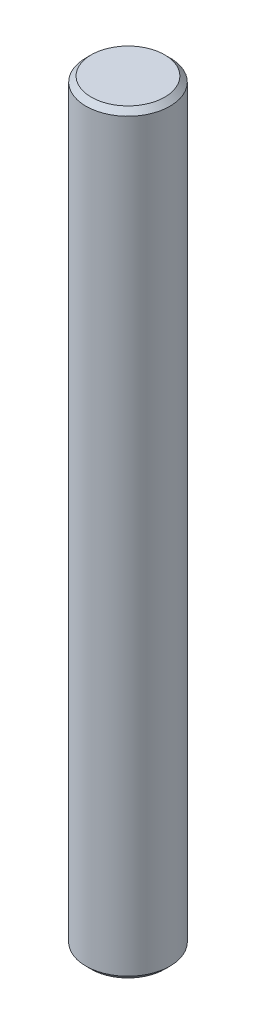
ISO-10303-21;
HEADER;
FILE_DESCRIPTION(('STEP AP214'),'2;1');
FILE_NAME('part.step','',(''),(''),'','','');
FILE_SCHEMA(('AUTOMOTIVE_DESIGN { 1 0 10303 214 1 1 1 1 }'));
ENDSEC;
DATA;
#1=APPLICATION_CONTEXT('core data for automotive mechanical design processes');
#2=APPLICATION_PROTOCOL_DEFINITION('international standard','automotive_design',2000,#1);
#3=PRODUCT_CONTEXT('',#1,'mechanical');
#4=PRODUCT('Part','Part','',(#3));
#5=PRODUCT_RELATED_PRODUCT_CATEGORY('part','',(#4));
#6=PRODUCT_DEFINITION_FORMATION('','',#4);
#7=PRODUCT_DEFINITION_CONTEXT('part definition',#1,'design');
#8=PRODUCT_DEFINITION('design','',#6,#7);
#9=PRODUCT_DEFINITION_SHAPE('','',#8);
#10=(LENGTH_UNIT() NAMED_UNIT(*) SI_UNIT(.MILLI.,.METRE.));
#11=(NAMED_UNIT(*) PLANE_ANGLE_UNIT() SI_UNIT($,.RADIAN.));
#12=(NAMED_UNIT(*) SI_UNIT($,.STERADIAN.) SOLID_ANGLE_UNIT());
#13=UNCERTAINTY_MEASURE_WITH_UNIT(LENGTH_MEASURE(1.E-05),#10,'distance_accuracy_value','');
#14=(GEOMETRIC_REPRESENTATION_CONTEXT(3) GLOBAL_UNCERTAINTY_ASSIGNED_CONTEXT((#13)) GLOBAL_UNIT_ASSIGNED_CONTEXT((#10,
#11,#12)) REPRESENTATION_CONTEXT('',''));
#15=CARTESIAN_POINT('',(0.,0.,0.));
#16=DIRECTION('',(0.,0.,1.));
#17=DIRECTION('',(1.,0.,0.));
#18=AXIS2_PLACEMENT_3D('',#15,#16,#17);
#19=CARTESIAN_POINT('',(0.,36.,0.));
#20=DIRECTION('',(0.,-1.,0.));
#21=DIRECTION('',(0.,0.,-1.));
#22=AXIS2_PLACEMENT_3D('',#19,#20,#21);
#23=CYLINDRICAL_SURFACE('',#22,4.);
#24=CARTESIAN_POINT('',(0.,-35.5,0.));
#25=DIRECTION('',(0.,1.,0.));
#26=DIRECTION('',(0.,0.,1.));
#27=AXIS2_PLACEMENT_3D('',#24,#25,#26);
#28=CIRCLE('',#27,4.);
#29=CARTESIAN_POINT('',(0.,-35.5,4.));
#30=VERTEX_POINT('',#29);
#31=EDGE_CURVE('E49',#30,#30,#28,.T.);
#32=ORIENTED_EDGE('',*,*,#31,.T.);
#33=EDGE_LOOP('',(#32));
#34=FACE_BOUND('',#33,.T.);
#35=CARTESIAN_POINT('',(0.,35.5,0.));
#36=DIRECTION('',(0.,1.,0.));
#37=DIRECTION('',(0.,0.,1.));
#38=AXIS2_PLACEMENT_3D('',#35,#36,#37);
#39=CIRCLE('',#38,4.);
#40=CARTESIAN_POINT('',(0.,35.5,4.));
#41=VERTEX_POINT('',#40);
#42=EDGE_CURVE('E53',#41,#41,#39,.F.);
#43=ORIENTED_EDGE('',*,*,#42,.T.);
#44=EDGE_LOOP('',(#43));
#45=FACE_BOUND('',#44,.T.);
#46=ADVANCED_FACE('F37',(#34,#45),#23,.T.);
#47=CARTESIAN_POINT('',(0.,36.,0.));
#48=DIRECTION('',(0.,1.,0.));
#49=DIRECTION('',(0.,0.,1.));
#50=AXIS2_PLACEMENT_3D('',#47,#48,#49);
#51=PLANE('',#50);
#52=CARTESIAN_POINT('',(0.,36.,0.));
#53=DIRECTION('',(0.,1.,0.));
#54=DIRECTION('',(0.,0.,1.));
#55=AXIS2_PLACEMENT_3D('',#52,#53,#54);
#56=CIRCLE('',#55,3.5);
#57=CARTESIAN_POINT('',(0.,36.,3.5));
#58=VERTEX_POINT('',#57);
#59=EDGE_CURVE('E10',#58,#58,#56,.T.);
#60=ORIENTED_EDGE('',*,*,#59,.T.);
#61=EDGE_LOOP('',(#60));
#62=FACE_BOUND('',#61,.T.);
#63=ADVANCED_FACE('F69',(#62),#51,.T.);
#64=CARTESIAN_POINT('',(0.,-36.,0.));
#65=DIRECTION('',(0.,1.,0.));
#66=DIRECTION('',(0.,0.,1.));
#67=AXIS2_PLACEMENT_3D('',#64,#65,#66);
#68=PLANE('',#67);
#69=CARTESIAN_POINT('',(0.,-36.,0.));
#70=DIRECTION('',(0.,1.,0.));
#71=DIRECTION('',(0.,0.,1.));
#72=AXIS2_PLACEMENT_3D('',#69,#70,#71);
#73=CIRCLE('',#72,3.49999999999999);
#74=CARTESIAN_POINT('',(0.,-36.,3.49999999999999));
#75=VERTEX_POINT('',#74);
#76=EDGE_CURVE('E45',#75,#75,#73,.F.);
#77=ORIENTED_EDGE('',*,*,#76,.T.);
#78=EDGE_LOOP('',(#77));
#79=FACE_BOUND('',#78,.T.);
#80=ADVANCED_FACE('F66',(#79),#68,.F.);
#81=CARTESIAN_POINT('',(0.,-35.5,0.));
#82=DIRECTION('',(0.,1.,0.));
#83=DIRECTION('',(0.,0.,1.));
#84=AXIS2_PLACEMENT_3D('',#81,#82,#83);
#85=CONICAL_SURFACE('',#84,4.,0.785398163397444);
#86=ORIENTED_EDGE('',*,*,#76,.F.);
#87=EDGE_LOOP('',(#86));
#88=FACE_BOUND('',#87,.T.);
#89=ORIENTED_EDGE('',*,*,#31,.F.);
#90=EDGE_LOOP('',(#89));
#91=FACE_BOUND('',#90,.T.);
#92=ADVANCED_FACE('F62',(#88,#91),#85,.T.);
#93=CARTESIAN_POINT('',(0.,36.,0.));
#94=DIRECTION('',(0.,-1.,0.));
#95=DIRECTION('',(0.,0.,-1.));
#96=AXIS2_PLACEMENT_3D('',#93,#94,#95);
#97=CONICAL_SURFACE('',#96,3.5,0.785398163397444);
#98=ORIENTED_EDGE('',*,*,#42,.F.);
#99=EDGE_LOOP('',(#98));
#100=FACE_BOUND('',#99,.T.);
#101=ORIENTED_EDGE('',*,*,#59,.F.);
#102=EDGE_LOOP('',(#101));
#103=FACE_BOUND('',#102,.T.);
#104=ADVANCED_FACE('F40',(#100,#103),#97,.T.);
#105=CLOSED_SHELL('',(#46,#63,#80,#92,#104));
#106=MANIFOLD_SOLID_BREP('B2',#105);
#107=ADVANCED_BREP_SHAPE_REPRESENTATION('',(#18,#106),#14);
#108=SHAPE_DEFINITION_REPRESENTATION(#9,#107);
ENDSEC;
END-ISO-10303-21;
